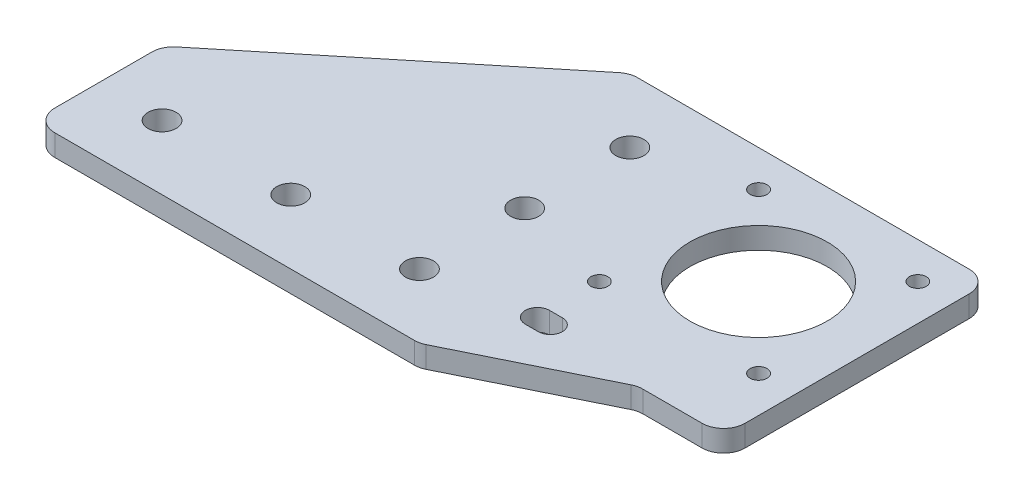
ISO-10303-21;
HEADER;
FILE_DESCRIPTION(('STEP AP214'),'2;1');
FILE_NAME('part.step','',(''),(''),'','','');
FILE_SCHEMA(('AUTOMOTIVE_DESIGN { 1 0 10303 214 1 1 1 1 }'));
ENDSEC;
DATA;
#1=APPLICATION_CONTEXT('core data for automotive mechanical design processes');
#2=APPLICATION_PROTOCOL_DEFINITION('international standard','automotive_design',2000,#1);
#3=PRODUCT_CONTEXT('',#1,'mechanical');
#4=PRODUCT('Part','Part','',(#3));
#5=PRODUCT_RELATED_PRODUCT_CATEGORY('part','',(#4));
#6=PRODUCT_DEFINITION_FORMATION('','',#4);
#7=PRODUCT_DEFINITION_CONTEXT('part definition',#1,'design');
#8=PRODUCT_DEFINITION('design','',#6,#7);
#9=PRODUCT_DEFINITION_SHAPE('','',#8);
#10=(LENGTH_UNIT() NAMED_UNIT(*) SI_UNIT(.MILLI.,.METRE.));
#11=(NAMED_UNIT(*) PLANE_ANGLE_UNIT() SI_UNIT($,.RADIAN.));
#12=(NAMED_UNIT(*) SI_UNIT($,.STERADIAN.) SOLID_ANGLE_UNIT());
#13=UNCERTAINTY_MEASURE_WITH_UNIT(LENGTH_MEASURE(1.E-05),#10,'distance_accuracy_value','');
#14=(GEOMETRIC_REPRESENTATION_CONTEXT(3) GLOBAL_UNCERTAINTY_ASSIGNED_CONTEXT((#13)) GLOBAL_UNIT_ASSIGNED_CONTEXT((#10,
#11,#12)) REPRESENTATION_CONTEXT('',''));
#15=CARTESIAN_POINT('',(0.,0.,0.));
#16=DIRECTION('',(0.,0.,1.));
#17=DIRECTION('',(1.,0.,0.));
#18=AXIS2_PLACEMENT_3D('',#15,#16,#17);
#19=CARTESIAN_POINT('',(514.35,25.3999999999964,590.55));
#20=DIRECTION('',(-0.632900218941656,0.,-0.774233371060434));
#21=DIRECTION('',(-0.774233371060434,0.,0.632900218941656));
#22=AXIS2_PLACEMENT_3D('',#19,#20,#21);
#23=PLANE('',#22);
#24=DIRECTION('',(0.774233371060434,0.,-0.632900218941656));
#25=VECTOR('',#24,1.);
#26=CARTESIAN_POINT('',(514.35,25.3999999999964,590.55));
#27=LINE('',#26,#25);
#28=CARTESIAN_POINT('',(516.68108360972,25.3999999999964,588.644446219823));
#29=VERTEX_POINT('',#28);
#30=CARTESIAN_POINT('',(588.796240187109,25.3999999999959,529.693618093766));
#31=VERTEX_POINT('',#30);
#32=EDGE_CURVE('E209',#29,#31,#27,.T.);
#33=ORIENTED_EDGE('',*,*,#32,.T.);
#34=DIRECTION('',(0.,-1.,0.));
#35=VECTOR('',#34,1.);
#36=CARTESIAN_POINT('',(588.796240187109,25.3999999999959,529.693618093766));
#37=LINE('',#36,#35);
#38=CARTESIAN_POINT('',(588.796240187109,19.0499999999959,529.693618093766));
#39=VERTEX_POINT('',#38);
#40=EDGE_CURVE('E251',#31,#39,#37,.T.);
#41=ORIENTED_EDGE('',*,*,#40,.T.);
#42=DIRECTION('',(0.774233371060434,0.,-0.632900218941656));
#43=VECTOR('',#42,1.);
#44=CARTESIAN_POINT('',(514.35,19.0499999999964,590.55));
#45=LINE('',#44,#43);
#46=CARTESIAN_POINT('',(516.68108360972,19.0499999999964,588.644446219823));
#47=VERTEX_POINT('',#46);
#48=EDGE_CURVE('E205',#47,#39,#45,.T.);
#49=ORIENTED_EDGE('',*,*,#48,.F.);
#50=DIRECTION('',(0.,-1.,0.));
#51=VECTOR('',#50,1.);
#52=CARTESIAN_POINT('',(516.68108360972,25.3999999999964,588.644446219823));
#53=LINE('',#52,#51);
#54=EDGE_CURVE('E230',#47,#29,#53,.F.);
#55=ORIENTED_EDGE('',*,*,#54,.T.);
#56=EDGE_LOOP('',(#33,#41,#49,#55));
#57=FACE_BOUND('',#56,.T.);
#58=ADVANCED_FACE('F34',(#57),#23,.T.);
#59=CARTESIAN_POINT('',(514.35,25.3999999999964,590.55));
#60=DIRECTION('',(-1.,0.,0.));
#61=DIRECTION('',(0.,-1.,0.));
#62=AXIS2_PLACEMENT_3D('',#59,#60,#61);
#63=PLANE('',#62);
#64=DIRECTION('',(0.,0.,-1.));
#65=VECTOR('',#64,1.);
#66=CARTESIAN_POINT('',(514.35,25.3999999999964,590.55));
#67=LINE('',#66,#65);
#68=CARTESIAN_POINT('',(514.35,25.3999999999964,622.300000000001));
#69=VERTEX_POINT('',#68);
#70=CARTESIAN_POINT('',(514.35,25.3999999999964,593.560828126057));
#71=VERTEX_POINT('',#70);
#72=EDGE_CURVE('E227',#69,#71,#67,.T.);
#73=ORIENTED_EDGE('',*,*,#72,.T.);
#74=DIRECTION('',(0.,-1.,0.));
#75=VECTOR('',#74,1.);
#76=CARTESIAN_POINT('',(514.35,25.3999999999964,593.560828126057));
#77=LINE('',#76,#75);
#78=CARTESIAN_POINT('',(514.35,19.0499999999964,593.560828126057));
#79=VERTEX_POINT('',#78);
#80=EDGE_CURVE('E284',#71,#79,#77,.T.);
#81=ORIENTED_EDGE('',*,*,#80,.T.);
#82=DIRECTION('',(0.,0.,-1.));
#83=VECTOR('',#82,1.);
#84=CARTESIAN_POINT('',(514.35,19.0499999999964,590.55));
#85=LINE('',#84,#83);
#86=CARTESIAN_POINT('',(514.35,19.0499999999964,622.300000000001));
#87=VERTEX_POINT('',#86);
#88=EDGE_CURVE('E213',#87,#79,#85,.T.);
#89=ORIENTED_EDGE('',*,*,#88,.F.);
#90=DIRECTION('',(0.,-1.,0.));
#91=VECTOR('',#90,1.);
#92=CARTESIAN_POINT('',(514.35,25.3999999999964,622.300000000001));
#93=LINE('',#92,#91);
#94=EDGE_CURVE('E282',#87,#69,#93,.F.);
#95=ORIENTED_EDGE('',*,*,#94,.T.);
#96=EDGE_LOOP('',(#73,#81,#89,#95));
#97=FACE_BOUND('',#96,.T.);
#98=ADVANCED_FACE('F401',(#97),#63,.T.);
#99=CARTESIAN_POINT('',(514.35,25.3999999999964,628.65));
#100=DIRECTION('',(0.,0.,1.));
#101=DIRECTION('',(1.,0.,0.));
#102=AXIS2_PLACEMENT_3D('',#99,#100,#101);
#103=PLANE('',#102);
#104=DIRECTION('',(-1.,0.,0.));
#105=VECTOR('',#104,1.);
#106=CARTESIAN_POINT('',(590.55,25.3999999999959,628.65));
#107=LINE('',#106,#105);
#108=CARTESIAN_POINT('',(627.170830477725,25.3999999999956,628.65));
#109=VERTEX_POINT('',#108);
#110=CARTESIAN_POINT('',(520.7,25.3999999999964,628.65));
#111=VERTEX_POINT('',#110);
#112=EDGE_CURVE('E224',#109,#111,#107,.T.);
#113=ORIENTED_EDGE('',*,*,#112,.T.);
#114=DIRECTION('',(0.,-1.,0.));
#115=VECTOR('',#114,1.);
#116=CARTESIAN_POINT('',(520.7,25.3999999999964,628.65));
#117=LINE('',#116,#115);
#118=CARTESIAN_POINT('',(520.7,19.0499999999964,628.65));
#119=VERTEX_POINT('',#118);
#120=EDGE_CURVE('E289',#111,#119,#117,.T.);
#121=ORIENTED_EDGE('',*,*,#120,.T.);
#122=DIRECTION('',(-1.,0.,0.));
#123=VECTOR('',#122,1.);
#124=CARTESIAN_POINT('',(514.35,19.0499999999964,628.65));
#125=LINE('',#124,#123);
#126=CARTESIAN_POINT('',(627.170830477725,19.0499999999956,628.65));
#127=VERTEX_POINT('',#126);
#128=EDGE_CURVE('E245',#127,#119,#125,.T.);
#129=ORIENTED_EDGE('',*,*,#128,.F.);
#130=DIRECTION('',(0.,-1.,0.));
#131=VECTOR('',#130,1.);
#132=CARTESIAN_POINT('',(627.170830477725,25.3999999999956,628.65));
#133=LINE('',#132,#131);
#134=EDGE_CURVE('E287',#127,#109,#133,.F.);
#135=ORIENTED_EDGE('',*,*,#134,.T.);
#136=EDGE_LOOP('',(#113,#121,#129,#135));
#137=FACE_BOUND('',#136,.T.);
#138=ADVANCED_FACE('F410',(#137),#103,.T.);
#139=CARTESIAN_POINT('',(628.65,25.3999999999956,628.65));
#140=DIRECTION('',(0.44190207955785,0.,0.897063293242148));
#141=DIRECTION('',(0.897063293242148,0.,-0.44190207955785));
#142=AXIS2_PLACEMENT_3D('',#139,#140,#141);
#143=PLANE('',#142);
#144=DIRECTION('',(-0.897063293242148,0.,0.44190207955785));
#145=VECTOR('',#144,1.);
#146=CARTESIAN_POINT('',(628.65,25.3999999999956,628.65));
#147=LINE('',#146,#145);
#148=CARTESIAN_POINT('',(670.623091317084,25.3999999999953,607.973648087913));
#149=VERTEX_POINT('',#148);
#150=CARTESIAN_POINT('',(629.976908682917,25.3999999999956,627.996351912088));
#151=VERTEX_POINT('',#150);
#152=EDGE_CURVE('E221',#149,#151,#147,.T.);
#153=ORIENTED_EDGE('',*,*,#152,.T.);
#154=DIRECTION('',(0.,-1.,0.));
#155=VECTOR('',#154,1.);
#156=CARTESIAN_POINT('',(629.976908682917,25.3999999999956,627.996351912088));
#157=LINE('',#156,#155);
#158=CARTESIAN_POINT('',(629.976908682917,19.0499999999956,627.996351912088));
#159=VERTEX_POINT('',#158);
#160=EDGE_CURVE('E294',#151,#159,#157,.T.);
#161=ORIENTED_EDGE('',*,*,#160,.T.);
#162=DIRECTION('',(-0.897063293242148,0.,0.44190207955785));
#163=VECTOR('',#162,1.);
#164=CARTESIAN_POINT('',(628.65,19.0499999999956,628.65));
#165=LINE('',#164,#163);
#166=CARTESIAN_POINT('',(670.623091317084,19.0499999999953,607.973648087913));
#167=VERTEX_POINT('',#166);
#168=EDGE_CURVE('E242',#167,#159,#165,.T.);
#169=ORIENTED_EDGE('',*,*,#168,.F.);
#170=DIRECTION('',(0.,-1.,0.));
#171=VECTOR('',#170,1.);
#172=CARTESIAN_POINT('',(670.623091317084,25.3999999999953,607.973648087913));
#173=LINE('',#172,#171);
#174=EDGE_CURVE('E292',#167,#149,#173,.F.);
#175=ORIENTED_EDGE('',*,*,#174,.T.);
#176=EDGE_LOOP('',(#153,#161,#169,#175));
#177=FACE_BOUND('',#176,.T.);
#178=ADVANCED_FACE('F419',(#177),#143,.T.);
#179=CARTESIAN_POINT('',(671.95,25.3999999999953,607.32));
#180=DIRECTION('',(0.,0.,1.));
#181=DIRECTION('',(1.,0.,0.));
#182=AXIS2_PLACEMENT_3D('',#179,#180,#181);
#183=PLANE('',#182);
#184=DIRECTION('',(-1.,0.,0.));
#185=VECTOR('',#184,1.);
#186=CARTESIAN_POINT('',(671.95,19.0499999999953,607.32));
#187=LINE('',#186,#185);
#188=CARTESIAN_POINT('',(691.,19.0499999999952,607.32));
#189=VERTEX_POINT('',#188);
#190=CARTESIAN_POINT('',(673.429169522276,19.0499999999953,607.32));
#191=VERTEX_POINT('',#190);
#192=EDGE_CURVE('E239',#189,#191,#187,.T.);
#193=ORIENTED_EDGE('',*,*,#192,.F.);
#194=DIRECTION('',(0.,-1.,0.));
#195=VECTOR('',#194,1.);
#196=CARTESIAN_POINT('',(691.,25.3999999999952,607.32));
#197=LINE('',#196,#195);
#198=CARTESIAN_POINT('',(691.,25.3999999999952,607.32));
#199=VERTEX_POINT('',#198);
#200=EDGE_CURVE('E304',#189,#199,#197,.F.);
#201=ORIENTED_EDGE('',*,*,#200,.T.);
#202=DIRECTION('',(-1.,0.,0.));
#203=VECTOR('',#202,1.);
#204=CARTESIAN_POINT('',(671.95,25.3999999999953,607.32));
#205=LINE('',#204,#203);
#206=CARTESIAN_POINT('',(673.429169522276,25.3999999999953,607.32));
#207=VERTEX_POINT('',#206);
#208=EDGE_CURVE('E218',#199,#207,#205,.T.);
#209=ORIENTED_EDGE('',*,*,#208,.T.);
#210=DIRECTION('',(0.,-1.,0.));
#211=VECTOR('',#210,1.);
#212=CARTESIAN_POINT('',(673.429169522276,19.0499999999953,607.32));
#213=LINE('',#212,#211);
#214=EDGE_CURVE('E301',#207,#191,#213,.T.);
#215=ORIENTED_EDGE('',*,*,#214,.T.);
#216=EDGE_LOOP('',(#193,#201,#209,#215));
#217=FACE_BOUND('',#216,.T.);
#218=ADVANCED_FACE('F426',(#217),#183,.T.);
#219=CARTESIAN_POINT('',(697.35,25.3999999999951,607.32));
#220=DIRECTION('',(1.,0.,0.));
#221=DIRECTION('',(0.,1.,0.));
#222=AXIS2_PLACEMENT_3D('',#219,#220,#221);
#223=PLANE('',#222);
#224=DIRECTION('',(0.,0.,1.));
#225=VECTOR('',#224,1.);
#226=CARTESIAN_POINT('',(697.35,19.0499999999951,607.32));
#227=LINE('',#226,#225);
#228=CARTESIAN_POINT('',(697.35,19.0499999999951,534.61));
#229=VERTEX_POINT('',#228);
#230=CARTESIAN_POINT('',(697.35,19.0499999999951,600.97));
#231=VERTEX_POINT('',#230);
#232=EDGE_CURVE('E236',#229,#231,#227,.T.);
#233=ORIENTED_EDGE('',*,*,#232,.F.);
#234=DIRECTION('',(0.,-1.,0.));
#235=VECTOR('',#234,1.);
#236=CARTESIAN_POINT('',(697.35,25.3999999999951,534.61));
#237=LINE('',#236,#235);
#238=CARTESIAN_POINT('',(697.35,25.3999999999951,534.61));
#239=VERTEX_POINT('',#238);
#240=EDGE_CURVE('E58',#229,#239,#237,.F.);
#241=ORIENTED_EDGE('',*,*,#240,.T.);
#242=DIRECTION('',(0.,0.,1.));
#243=VECTOR('',#242,1.);
#244=CARTESIAN_POINT('',(697.35,25.3999999999951,607.32));
#245=LINE('',#244,#243);
#246=CARTESIAN_POINT('',(697.35,25.3999999999951,600.97));
#247=VERTEX_POINT('',#246);
#248=EDGE_CURVE('E216',#239,#247,#245,.T.);
#249=ORIENTED_EDGE('',*,*,#248,.T.);
#250=DIRECTION('',(0.,-1.,0.));
#251=VECTOR('',#250,1.);
#252=CARTESIAN_POINT('',(697.35,25.3999999999951,600.97));
#253=LINE('',#252,#251);
#254=EDGE_CURVE('E297',#247,#231,#253,.T.);
#255=ORIENTED_EDGE('',*,*,#254,.T.);
#256=EDGE_LOOP('',(#233,#241,#249,#255));
#257=FACE_BOUND('',#256,.T.);
#258=ADVANCED_FACE('F431',(#257),#223,.T.);
#259=CARTESIAN_POINT('',(628.65,25.3999999999956,528.26));
#260=DIRECTION('',(0.,0.,-1.));
#261=DIRECTION('',(-1.,0.,0.));
#262=AXIS2_PLACEMENT_3D('',#259,#260,#261);
#263=PLANE('',#262);
#264=DIRECTION('',(1.,0.,0.));
#265=VECTOR('',#264,1.);
#266=CARTESIAN_POINT('',(628.65,19.0499999999956,528.26));
#267=LINE('',#266,#265);
#268=CARTESIAN_POINT('',(592.815156577388,19.0499999999959,528.26));
#269=VERTEX_POINT('',#268);
#270=CARTESIAN_POINT('',(691.,19.0499999999952,528.26));
#271=VERTEX_POINT('',#270);
#272=EDGE_CURVE('E233',#269,#271,#267,.T.);
#273=ORIENTED_EDGE('',*,*,#272,.F.);
#274=DIRECTION('',(0.,-1.,0.));
#275=VECTOR('',#274,1.);
#276=CARTESIAN_POINT('',(592.815156577388,25.3999999999959,528.26));
#277=LINE('',#276,#275);
#278=CARTESIAN_POINT('',(592.815156577388,25.3999999999959,528.26));
#279=VERTEX_POINT('',#278);
#280=EDGE_CURVE('E269',#269,#279,#277,.F.);
#281=ORIENTED_EDGE('',*,*,#280,.T.);
#282=DIRECTION('',(1.,0.,0.));
#283=VECTOR('',#282,1.);
#284=CARTESIAN_POINT('',(590.55,25.3999999999959,528.26));
#285=LINE('',#284,#283);
#286=CARTESIAN_POINT('',(691.,25.3999999999952,528.26));
#287=VERTEX_POINT('',#286);
#288=EDGE_CURVE('E212',#279,#287,#285,.T.);
#289=ORIENTED_EDGE('',*,*,#288,.T.);
#290=DIRECTION('',(0.,-1.,0.));
#291=VECTOR('',#290,1.);
#292=CARTESIAN_POINT('',(691.,25.3999999999952,528.26));
#293=LINE('',#292,#291);
#294=EDGE_CURVE('E266',#287,#271,#293,.T.);
#295=ORIENTED_EDGE('',*,*,#294,.T.);
#296=EDGE_LOOP('',(#273,#281,#289,#295));
#297=FACE_BOUND('',#296,.T.);
#298=ADVANCED_FACE('F369',(#297),#263,.T.);
#299=CARTESIAN_POINT('',(2.22044604925031E-13,25.4,0.));
#300=DIRECTION('',(0.,1.,0.));
#301=DIRECTION('',(-1.,0.,0.));
#302=AXIS2_PLACEMENT_3D('',#299,#300,#301);
#303=PLANE('',#302);
#304=CARTESIAN_POINT('',(639.43,25.3999999999964,586.18));
#305=DIRECTION('',(0.,1.,0.));
#306=DIRECTION('',(0.,0.,1.));
#307=AXIS2_PLACEMENT_3D('',#304,#305,#306);
#308=CIRCLE('',#307,2.50000000000002);
#309=CARTESIAN_POINT('',(639.43,25.3999999999964,588.68));
#310=VERTEX_POINT('',#309);
#311=EDGE_CURVE('E348',#310,#310,#308,.T.);
#312=ORIENTED_EDGE('',*,*,#311,.F.);
#313=EDGE_LOOP('',(#312));
#314=FACE_BOUND('',#313,.T.);
#315=CARTESIAN_POINT('',(686.57,25.3999999999964,586.18));
#316=DIRECTION('',(0.,1.,0.));
#317=DIRECTION('',(0.,0.,1.));
#318=AXIS2_PLACEMENT_3D('',#315,#316,#317);
#319=CIRCLE('',#318,2.49999999999992);
#320=CARTESIAN_POINT('',(686.57,25.3999999999964,588.68));
#321=VERTEX_POINT('',#320);
#322=EDGE_CURVE('E338',#321,#321,#319,.T.);
#323=ORIENTED_EDGE('',*,*,#322,.F.);
#324=EDGE_LOOP('',(#323));
#325=FACE_BOUND('',#324,.T.);
#326=CARTESIAN_POINT('',(639.43,25.3999999999964,539.04));
#327=DIRECTION('',(0.,1.,0.));
#328=DIRECTION('',(0.,0.,1.));
#329=AXIS2_PLACEMENT_3D('',#326,#327,#328);
#330=CIRCLE('',#329,2.50000000000002);
#331=CARTESIAN_POINT('',(639.43,25.3999999999964,541.54));
#332=VERTEX_POINT('',#331);
#333=EDGE_CURVE('E335',#332,#332,#330,.T.);
#334=ORIENTED_EDGE('',*,*,#333,.F.);
#335=EDGE_LOOP('',(#334));
#336=FACE_BOUND('',#335,.T.);
#337=CARTESIAN_POINT('',(686.57,25.3999999999964,539.04));
#338=DIRECTION('',(0.,1.,0.));
#339=DIRECTION('',(0.,0.,1.));
#340=AXIS2_PLACEMENT_3D('',#337,#338,#339);
#341=CIRCLE('',#340,2.49999999999992);
#342=CARTESIAN_POINT('',(686.57,25.3999999999964,541.54));
#343=VERTEX_POINT('',#342);
#344=EDGE_CURVE('E332',#343,#343,#341,.T.);
#345=ORIENTED_EDGE('',*,*,#344,.F.);
#346=EDGE_LOOP('',(#345));
#347=FACE_BOUND('',#346,.T.);
#348=CARTESIAN_POINT('',(663.,25.3999999999964,562.61));
#349=DIRECTION('',(0.,1.,0.));
#350=DIRECTION('',(0.,0.,1.));
#351=AXIS2_PLACEMENT_3D('',#348,#349,#350);
#352=CIRCLE('',#351,20.32);
#353=CARTESIAN_POINT('',(663.,25.3999999999964,582.93));
#354=VERTEX_POINT('',#353);
#355=EDGE_CURVE('E328',#354,#354,#352,.T.);
#356=ORIENTED_EDGE('',*,*,#355,.F.);
#357=EDGE_LOOP('',(#356));
#358=FACE_BOUND('',#357,.T.);
#359=CARTESIAN_POINT('',(609.6,25.3999999999964,609.6));
#360=DIRECTION('',(0.,1.,0.));
#361=DIRECTION('',(0.,0.,1.));
#362=AXIS2_PLACEMENT_3D('',#359,#360,#361);
#363=CIRCLE('',#362,4.16560000000004);
#364=CARTESIAN_POINT('',(609.6,25.3999999999964,613.7656));
#365=VERTEX_POINT('',#364);
#366=EDGE_CURVE('E324',#365,#365,#363,.T.);
#367=ORIENTED_EDGE('',*,*,#366,.F.);
#368=EDGE_LOOP('',(#367));
#369=FACE_BOUND('',#368,.T.);
#370=CARTESIAN_POINT('',(609.6,25.3999999999964,547.31));
#371=DIRECTION('',(0.,1.,0.));
#372=DIRECTION('',(0.,0.,1.));
#373=AXIS2_PLACEMENT_3D('',#370,#371,#372);
#374=CIRCLE('',#373,4.16560000000004);
#375=CARTESIAN_POINT('',(609.6,25.3999999999964,551.4756));
#376=VERTEX_POINT('',#375);
#377=EDGE_CURVE('E320',#376,#376,#374,.T.);
#378=ORIENTED_EDGE('',*,*,#377,.F.);
#379=EDGE_LOOP('',(#378));
#380=FACE_BOUND('',#379,.T.);
#381=CARTESIAN_POINT('',(609.6,25.3999999999964,578.455));
#382=DIRECTION('',(0.,1.,0.));
#383=DIRECTION('',(0.,0.,1.));
#384=AXIS2_PLACEMENT_3D('',#381,#382,#383);
#385=CIRCLE('',#384,4.16560000000004);
#386=CARTESIAN_POINT('',(609.6,25.3999999999964,582.6206));
#387=VERTEX_POINT('',#386);
#388=EDGE_CURVE('E316',#387,#387,#385,.T.);
#389=ORIENTED_EDGE('',*,*,#388,.F.);
#390=EDGE_LOOP('',(#389));
#391=FACE_BOUND('',#390,.T.);
#392=CARTESIAN_POINT('',(571.5,25.3999999999964,609.6));
#393=DIRECTION('',(0.,1.,0.));
#394=DIRECTION('',(0.,0.,1.));
#395=AXIS2_PLACEMENT_3D('',#392,#393,#394);
#396=CIRCLE('',#395,4.16560000000004);
#397=CARTESIAN_POINT('',(571.5,25.3999999999964,613.7656));
#398=VERTEX_POINT('',#397);
#399=EDGE_CURVE('E312',#398,#398,#396,.T.);
#400=ORIENTED_EDGE('',*,*,#399,.F.);
#401=EDGE_LOOP('',(#400));
#402=FACE_BOUND('',#401,.T.);
#403=CARTESIAN_POINT('',(533.4,25.3999999999964,609.6));
#404=DIRECTION('',(0.,1.,0.));
#405=DIRECTION('',(0.,0.,1.));
#406=AXIS2_PLACEMENT_3D('',#403,#404,#405);
#407=CIRCLE('',#406,4.16560000000004);
#408=CARTESIAN_POINT('',(533.4,25.3999999999964,613.7656));
#409=VERTEX_POINT('',#408);
#410=EDGE_CURVE('E192',#409,#409,#407,.T.);
#411=ORIENTED_EDGE('',*,*,#410,.F.);
#412=EDGE_LOOP('',(#411));
#413=FACE_BOUND('',#412,.T.);
#414=CARTESIAN_POINT('',(639.445,25.3999999999955,604.52));
#415=DIRECTION('',(0.,-1.,0.));
#416=DIRECTION('',(1.,0.,0.));
#417=AXIS2_PLACEMENT_3D('',#414,#415,#416);
#418=CIRCLE('',#417,3.56869999999987);
#419=CARTESIAN_POINT('',(639.445,25.3999999999955,608.0887));
#420=VERTEX_POINT('',#419);
#421=CARTESIAN_POINT('',(639.445,25.3999999999955,600.9513));
#422=VERTEX_POINT('',#421);
#423=EDGE_CURVE('E166',#420,#422,#418,.T.);
#424=ORIENTED_EDGE('',*,*,#423,.T.);
#425=DIRECTION('',(1.,0.,0.));
#426=VECTOR('',#425,1.);
#427=CARTESIAN_POINT('',(639.445,25.3999999999955,600.9513));
#428=LINE('',#427,#426);
#429=CARTESIAN_POINT('',(643.255,25.3999999999955,600.9513));
#430=VERTEX_POINT('',#429);
#431=EDGE_CURVE('E178',#422,#430,#428,.T.);
#432=ORIENTED_EDGE('',*,*,#431,.T.);
#433=CARTESIAN_POINT('',(643.255,25.3999999999955,604.52));
#434=DIRECTION('',(0.,-1.,0.));
#435=DIRECTION('',(1.,0.,0.));
#436=AXIS2_PLACEMENT_3D('',#433,#434,#435);
#437=CIRCLE('',#436,3.56869999999987);
#438=CARTESIAN_POINT('',(643.255,25.3999999999955,608.0887));
#439=VERTEX_POINT('',#438);
#440=EDGE_CURVE('E182',#430,#439,#437,.T.);
#441=ORIENTED_EDGE('',*,*,#440,.T.);
#442=DIRECTION('',(-1.,0.,0.));
#443=VECTOR('',#442,1.);
#444=CARTESIAN_POINT('',(639.445,25.3999999999955,608.0887));
#445=LINE('',#444,#443);
#446=EDGE_CURVE('E174',#439,#420,#445,.T.);
#447=ORIENTED_EDGE('',*,*,#446,.T.);
#448=EDGE_LOOP('',(#424,#432,#441,#447));
#449=FACE_BOUND('',#448,.T.);
#450=ORIENTED_EDGE('',*,*,#288,.F.);
#451=CARTESIAN_POINT('',(592.815156577388,25.3999999999959,534.61));
#452=DIRECTION('',(0.,1.,0.));
#453=DIRECTION('',(-1.,0.,0.));
#454=AXIS2_PLACEMENT_3D('',#451,#452,#453);
#455=CIRCLE('',#454,6.35);
#456=EDGE_CURVE('E280',#279,#31,#455,.T.);
#457=ORIENTED_EDGE('',*,*,#456,.T.);
#458=ORIENTED_EDGE('',*,*,#32,.F.);
#459=CARTESIAN_POINT('',(520.7,25.3999999999964,593.560828126057));
#460=DIRECTION('',(0.,1.,0.));
#461=DIRECTION('',(-1.,0.,0.));
#462=AXIS2_PLACEMENT_3D('',#459,#460,#461);
#463=CIRCLE('',#462,6.35);
#464=EDGE_CURVE('E278',#29,#71,#463,.T.);
#465=ORIENTED_EDGE('',*,*,#464,.T.);
#466=ORIENTED_EDGE('',*,*,#72,.F.);
#467=CARTESIAN_POINT('',(520.7,25.3999999999964,622.300000000001));
#468=DIRECTION('',(0.,1.,0.));
#469=DIRECTION('',(-1.,0.,0.));
#470=AXIS2_PLACEMENT_3D('',#467,#468,#469);
#471=CIRCLE('',#470,6.35);
#472=EDGE_CURVE('E276',#69,#111,#471,.T.);
#473=ORIENTED_EDGE('',*,*,#472,.T.);
#474=ORIENTED_EDGE('',*,*,#112,.F.);
#475=CARTESIAN_POINT('',(627.170830477725,25.3999999999956,622.3));
#476=DIRECTION('',(0.,1.,0.));
#477=DIRECTION('',(-1.,0.,0.));
#478=AXIS2_PLACEMENT_3D('',#475,#476,#477);
#479=CIRCLE('',#478,6.35);
#480=EDGE_CURVE('E274',#109,#151,#479,.T.);
#481=ORIENTED_EDGE('',*,*,#480,.T.);
#482=ORIENTED_EDGE('',*,*,#152,.F.);
#483=CARTESIAN_POINT('',(673.429169522276,25.3999999999953,613.67));
#484=DIRECTION('',(0.,1.,0.));
#485=DIRECTION('',(-1.,0.,0.));
#486=AXIS2_PLACEMENT_3D('',#483,#484,#485);
#487=CIRCLE('',#486,6.35);
#488=EDGE_CURVE('E11',#149,#207,#487,.F.);
#489=ORIENTED_EDGE('',*,*,#488,.T.);
#490=ORIENTED_EDGE('',*,*,#208,.F.);
#491=CARTESIAN_POINT('',(691.,25.3999999999952,600.97));
#492=DIRECTION('',(0.,1.,0.));
#493=DIRECTION('',(-1.,0.,0.));
#494=AXIS2_PLACEMENT_3D('',#491,#492,#493);
#495=CIRCLE('',#494,6.35);
#496=EDGE_CURVE('E51',#199,#247,#495,.T.);
#497=ORIENTED_EDGE('',*,*,#496,.T.);
#498=ORIENTED_EDGE('',*,*,#248,.F.);
#499=CARTESIAN_POINT('',(691.,25.3999999999952,534.61));
#500=DIRECTION('',(0.,1.,0.));
#501=DIRECTION('',(-1.,0.,0.));
#502=AXIS2_PLACEMENT_3D('',#499,#500,#501);
#503=CIRCLE('',#502,6.35);
#504=EDGE_CURVE('E272',#239,#287,#503,.T.);
#505=ORIENTED_EDGE('',*,*,#504,.T.);
#506=EDGE_LOOP('',(#450,#457,#458,#465,#466,#473,#474,#481,#482,#489,#490,#497,#498,#505));
#507=FACE_BOUND('',#506,.T.);
#508=ADVANCED_FACE('F184',(#314,#325,#336,#347,#358,#369,#380,#391,#402,#413,#449,#507),#303,.T.);
#509=CARTESIAN_POINT('',(1.11022302462516E-13,19.05,0.));
#510=DIRECTION('',(0.,1.,0.));
#511=DIRECTION('',(-1.,0.,0.));
#512=AXIS2_PLACEMENT_3D('',#509,#510,#511);
#513=PLANE('',#512);
#514=CARTESIAN_POINT('',(639.43,19.0499999999955,586.18));
#515=DIRECTION('',(0.,1.,0.));
#516=DIRECTION('',(-1.,0.,0.));
#517=AXIS2_PLACEMENT_3D('',#514,#515,#516);
#518=CIRCLE('',#517,2.50000000000002);
#519=CARTESIAN_POINT('',(636.93,19.0499999999956,586.18));
#520=VERTEX_POINT('',#519);
#521=EDGE_CURVE('E38',#520,#520,#518,.F.);
#522=ORIENTED_EDGE('',*,*,#521,.F.);
#523=EDGE_LOOP('',(#522));
#524=FACE_BOUND('',#523,.T.);
#525=CARTESIAN_POINT('',(686.57,19.0499999999952,586.18));
#526=DIRECTION('',(0.,1.,0.));
#527=DIRECTION('',(-1.,0.,0.));
#528=AXIS2_PLACEMENT_3D('',#525,#526,#527);
#529=CIRCLE('',#528,2.49999999999992);
#530=CARTESIAN_POINT('',(684.07,19.0499999999952,586.18));
#531=VERTEX_POINT('',#530);
#532=EDGE_CURVE('E336',#531,#531,#529,.F.);
#533=ORIENTED_EDGE('',*,*,#532,.F.);
#534=EDGE_LOOP('',(#533));
#535=FACE_BOUND('',#534,.T.);
#536=CARTESIAN_POINT('',(639.43,19.0499999999955,539.04));
#537=DIRECTION('',(0.,1.,0.));
#538=DIRECTION('',(-1.,0.,0.));
#539=AXIS2_PLACEMENT_3D('',#536,#537,#538);
#540=CIRCLE('',#539,2.50000000000002);
#541=CARTESIAN_POINT('',(636.93,19.0499999999956,539.04));
#542=VERTEX_POINT('',#541);
#543=EDGE_CURVE('E333',#542,#542,#540,.F.);
#544=ORIENTED_EDGE('',*,*,#543,.F.);
#545=EDGE_LOOP('',(#544));
#546=FACE_BOUND('',#545,.T.);
#547=CARTESIAN_POINT('',(686.57,19.0499999999952,539.04));
#548=DIRECTION('',(0.,1.,0.));
#549=DIRECTION('',(-1.,0.,0.));
#550=AXIS2_PLACEMENT_3D('',#547,#548,#549);
#551=CIRCLE('',#550,2.49999999999992);
#552=CARTESIAN_POINT('',(684.07,19.0499999999952,539.04));
#553=VERTEX_POINT('',#552);
#554=EDGE_CURVE('E329',#553,#553,#551,.F.);
#555=ORIENTED_EDGE('',*,*,#554,.F.);
#556=EDGE_LOOP('',(#555));
#557=FACE_BOUND('',#556,.T.);
#558=CARTESIAN_POINT('',(663.,19.0499999999954,562.61));
#559=DIRECTION('',(0.,1.,0.));
#560=DIRECTION('',(-1.,0.,0.));
#561=AXIS2_PLACEMENT_3D('',#558,#559,#560);
#562=CIRCLE('',#561,20.32);
#563=CARTESIAN_POINT('',(642.68,19.0499999999955,562.61));
#564=VERTEX_POINT('',#563);
#565=EDGE_CURVE('E325',#564,#564,#562,.F.);
#566=ORIENTED_EDGE('',*,*,#565,.F.);
#567=EDGE_LOOP('',(#566));
#568=FACE_BOUND('',#567,.T.);
#569=CARTESIAN_POINT('',(609.6,19.0499999999957,609.6));
#570=DIRECTION('',(0.,1.,0.));
#571=DIRECTION('',(-1.,0.,0.));
#572=AXIS2_PLACEMENT_3D('',#569,#570,#571);
#573=CIRCLE('',#572,4.16560000000004);
#574=CARTESIAN_POINT('',(605.4344,19.0499999999958,609.6));
#575=VERTEX_POINT('',#574);
#576=EDGE_CURVE('E321',#575,#575,#573,.F.);
#577=ORIENTED_EDGE('',*,*,#576,.F.);
#578=EDGE_LOOP('',(#577));
#579=FACE_BOUND('',#578,.T.);
#580=CARTESIAN_POINT('',(609.6,19.0499999999957,547.31));
#581=DIRECTION('',(0.,1.,0.));
#582=DIRECTION('',(-1.,0.,0.));
#583=AXIS2_PLACEMENT_3D('',#580,#581,#582);
#584=CIRCLE('',#583,4.16560000000004);
#585=CARTESIAN_POINT('',(605.4344,19.0499999999958,547.31));
#586=VERTEX_POINT('',#585);
#587=EDGE_CURVE('E317',#586,#586,#584,.F.);
#588=ORIENTED_EDGE('',*,*,#587,.F.);
#589=EDGE_LOOP('',(#588));
#590=FACE_BOUND('',#589,.T.);
#591=CARTESIAN_POINT('',(609.6,19.0499999999957,578.455));
#592=DIRECTION('',(0.,1.,0.));
#593=DIRECTION('',(-1.,0.,0.));
#594=AXIS2_PLACEMENT_3D('',#591,#592,#593);
#595=CIRCLE('',#594,4.16560000000004);
#596=CARTESIAN_POINT('',(605.4344,19.0499999999958,578.455));
#597=VERTEX_POINT('',#596);
#598=EDGE_CURVE('E313',#597,#597,#595,.F.);
#599=ORIENTED_EDGE('',*,*,#598,.F.);
#600=EDGE_LOOP('',(#599));
#601=FACE_BOUND('',#600,.T.);
#602=CARTESIAN_POINT('',(571.5,19.049999999996,609.6));
#603=DIRECTION('',(0.,1.,0.));
#604=DIRECTION('',(-1.,0.,0.));
#605=AXIS2_PLACEMENT_3D('',#602,#603,#604);
#606=CIRCLE('',#605,4.16560000000004);
#607=CARTESIAN_POINT('',(567.3344,19.049999999996,609.6));
#608=VERTEX_POINT('',#607);
#609=EDGE_CURVE('E309',#608,#608,#606,.F.);
#610=ORIENTED_EDGE('',*,*,#609,.F.);
#611=EDGE_LOOP('',(#610));
#612=FACE_BOUND('',#611,.T.);
#613=CARTESIAN_POINT('',(533.4,19.0499999999963,609.6));
#614=DIRECTION('',(0.,1.,0.));
#615=DIRECTION('',(-1.,0.,0.));
#616=AXIS2_PLACEMENT_3D('',#613,#614,#615);
#617=CIRCLE('',#616,4.16560000000004);
#618=CARTESIAN_POINT('',(529.2344,19.0499999999963,609.6));
#619=VERTEX_POINT('',#618);
#620=EDGE_CURVE('E199',#619,#619,#617,.F.);
#621=ORIENTED_EDGE('',*,*,#620,.F.);
#622=EDGE_LOOP('',(#621));
#623=FACE_BOUND('',#622,.T.);
#624=DIRECTION('',(1.,0.,0.));
#625=VECTOR('',#624,1.);
#626=CARTESIAN_POINT('',(639.445,19.0499999999955,600.9513));
#627=LINE('',#626,#625);
#628=CARTESIAN_POINT('',(639.445,19.0499999999955,600.9513));
#629=VERTEX_POINT('',#628);
#630=CARTESIAN_POINT('',(643.255,19.0499999999955,600.9513));
#631=VERTEX_POINT('',#630);
#632=EDGE_CURVE('E198',#629,#631,#627,.T.);
#633=ORIENTED_EDGE('',*,*,#632,.F.);
#634=CARTESIAN_POINT('',(639.445,19.0499999999955,604.52));
#635=DIRECTION('',(0.,-1.,0.));
#636=DIRECTION('',(1.,0.,0.));
#637=AXIS2_PLACEMENT_3D('',#634,#635,#636);
#638=CIRCLE('',#637,3.56869999999987);
#639=CARTESIAN_POINT('',(639.445,19.0499999999955,608.0887));
#640=VERTEX_POINT('',#639);
#641=EDGE_CURVE('E169',#640,#629,#638,.T.);
#642=ORIENTED_EDGE('',*,*,#641,.F.);
#643=DIRECTION('',(-1.,0.,0.));
#644=VECTOR('',#643,1.);
#645=CARTESIAN_POINT('',(639.445,19.0499999999955,608.0887));
#646=LINE('',#645,#644);
#647=CARTESIAN_POINT('',(643.255,19.0499999999955,608.0887));
#648=VERTEX_POINT('',#647);
#649=EDGE_CURVE('E186',#648,#640,#646,.T.);
#650=ORIENTED_EDGE('',*,*,#649,.F.);
#651=CARTESIAN_POINT('',(643.255,19.0499999999955,604.52));
#652=DIRECTION('',(0.,-1.,0.));
#653=DIRECTION('',(1.,0.,0.));
#654=AXIS2_PLACEMENT_3D('',#651,#652,#653);
#655=CIRCLE('',#654,3.56869999999987);
#656=EDGE_CURVE('E189',#631,#648,#655,.T.);
#657=ORIENTED_EDGE('',*,*,#656,.F.);
#658=EDGE_LOOP('',(#633,#642,#650,#657));
#659=FACE_BOUND('',#658,.T.);
#660=ORIENTED_EDGE('',*,*,#48,.T.);
#661=CARTESIAN_POINT('',(592.815156577388,19.0499999999959,534.61));
#662=DIRECTION('',(0.,1.,0.));
#663=DIRECTION('',(-1.,0.,0.));
#664=AXIS2_PLACEMENT_3D('',#661,#662,#663);
#665=CIRCLE('',#664,6.35);
#666=EDGE_CURVE('E264',#39,#269,#665,.F.);
#667=ORIENTED_EDGE('',*,*,#666,.T.);
#668=ORIENTED_EDGE('',*,*,#272,.T.);
#669=CARTESIAN_POINT('',(691.,19.0499999999952,534.61));
#670=DIRECTION('',(0.,1.,0.));
#671=DIRECTION('',(-1.,0.,0.));
#672=AXIS2_PLACEMENT_3D('',#669,#670,#671);
#673=CIRCLE('',#672,6.35);
#674=EDGE_CURVE('E256',#271,#229,#673,.F.);
#675=ORIENTED_EDGE('',*,*,#674,.T.);
#676=ORIENTED_EDGE('',*,*,#232,.T.);
#677=CARTESIAN_POINT('',(691.,19.0499999999952,600.97));
#678=DIRECTION('',(0.,1.,0.));
#679=DIRECTION('',(-1.,0.,0.));
#680=AXIS2_PLACEMENT_3D('',#677,#678,#679);
#681=CIRCLE('',#680,6.35);
#682=EDGE_CURVE('E254',#231,#189,#681,.F.);
#683=ORIENTED_EDGE('',*,*,#682,.T.);
#684=ORIENTED_EDGE('',*,*,#192,.T.);
#685=CARTESIAN_POINT('',(673.429169522276,19.0499999999953,613.67));
#686=DIRECTION('',(0.,1.,0.));
#687=DIRECTION('',(-1.,0.,0.));
#688=AXIS2_PLACEMENT_3D('',#685,#686,#687);
#689=CIRCLE('',#688,6.35);
#690=EDGE_CURVE('E43',#191,#167,#689,.T.);
#691=ORIENTED_EDGE('',*,*,#690,.T.);
#692=ORIENTED_EDGE('',*,*,#168,.T.);
#693=CARTESIAN_POINT('',(627.170830477725,19.0499999999956,622.3));
#694=DIRECTION('',(0.,1.,0.));
#695=DIRECTION('',(-1.,0.,0.));
#696=AXIS2_PLACEMENT_3D('',#693,#694,#695);
#697=CIRCLE('',#696,6.35);
#698=EDGE_CURVE('E258',#159,#127,#697,.F.);
#699=ORIENTED_EDGE('',*,*,#698,.T.);
#700=ORIENTED_EDGE('',*,*,#128,.T.);
#701=CARTESIAN_POINT('',(520.7,19.0499999999964,622.300000000001));
#702=DIRECTION('',(0.,1.,0.));
#703=DIRECTION('',(-1.,0.,0.));
#704=AXIS2_PLACEMENT_3D('',#701,#702,#703);
#705=CIRCLE('',#704,6.35);
#706=EDGE_CURVE('E260',#119,#87,#705,.F.);
#707=ORIENTED_EDGE('',*,*,#706,.T.);
#708=ORIENTED_EDGE('',*,*,#88,.T.);
#709=CARTESIAN_POINT('',(520.7,19.0499999999964,593.560828126057));
#710=DIRECTION('',(0.,1.,0.));
#711=DIRECTION('',(-1.,0.,0.));
#712=AXIS2_PLACEMENT_3D('',#709,#710,#711);
#713=CIRCLE('',#712,6.35);
#714=EDGE_CURVE('E262',#79,#47,#713,.F.);
#715=ORIENTED_EDGE('',*,*,#714,.T.);
#716=EDGE_LOOP('',(#660,#667,#668,#675,#676,#683,#684,#691,#692,#699,#700,#707,#708,#715));
#717=FACE_BOUND('',#716,.T.);
#718=ADVANCED_FACE('F368',(#524,#535,#546,#557,#568,#579,#590,#601,#612,#623,#659,#717),#513,.F.);
#719=CARTESIAN_POINT('',(639.445,25.3999999999955,604.52));
#720=DIRECTION('',(0.,-1.,0.));
#721=DIRECTION('',(1.,0.,0.));
#722=AXIS2_PLACEMENT_3D('',#719,#720,#721);
#723=CYLINDRICAL_SURFACE('',#722,3.56869999999987);
#724=ORIENTED_EDGE('',*,*,#641,.T.);
#725=DIRECTION('',(0.,-1.,0.));
#726=VECTOR('',#725,1.);
#727=CARTESIAN_POINT('',(639.445,25.3999999999955,600.9513));
#728=LINE('',#727,#726);
#729=EDGE_CURVE('E162',#422,#629,#728,.T.);
#730=ORIENTED_EDGE('',*,*,#729,.F.);
#731=ORIENTED_EDGE('',*,*,#423,.F.);
#732=DIRECTION('',(0.,-1.,0.));
#733=VECTOR('',#732,1.);
#734=CARTESIAN_POINT('',(639.445,25.3999999999955,608.0887));
#735=LINE('',#734,#733);
#736=EDGE_CURVE('E203',#420,#640,#735,.T.);
#737=ORIENTED_EDGE('',*,*,#736,.T.);
#738=EDGE_LOOP('',(#724,#730,#731,#737));
#739=FACE_BOUND('',#738,.T.);
#740=ADVANCED_FACE('F164',(#739),#723,.F.);
#741=CARTESIAN_POINT('',(639.445,25.3999999999955,608.0887));
#742=DIRECTION('',(0.,0.,1.));
#743=DIRECTION('',(1.,0.,0.));
#744=AXIS2_PLACEMENT_3D('',#741,#742,#743);
#745=PLANE('',#744);
#746=ORIENTED_EDGE('',*,*,#649,.T.);
#747=ORIENTED_EDGE('',*,*,#736,.F.);
#748=ORIENTED_EDGE('',*,*,#446,.F.);
#749=DIRECTION('',(0.,-1.,0.));
#750=VECTOR('',#749,1.);
#751=CARTESIAN_POINT('',(643.255,25.3999999999955,608.0887));
#752=LINE('',#751,#750);
#753=EDGE_CURVE('E206',#439,#648,#752,.T.);
#754=ORIENTED_EDGE('',*,*,#753,.T.);
#755=EDGE_LOOP('',(#746,#747,#748,#754));
#756=FACE_BOUND('',#755,.T.);
#757=ADVANCED_FACE('F468',(#756),#745,.F.);
#758=CARTESIAN_POINT('',(643.255,25.3999999999955,604.52));
#759=DIRECTION('',(0.,-1.,0.));
#760=DIRECTION('',(1.,0.,0.));
#761=AXIS2_PLACEMENT_3D('',#758,#759,#760);
#762=CYLINDRICAL_SURFACE('',#761,3.56869999999987);
#763=ORIENTED_EDGE('',*,*,#656,.T.);
#764=ORIENTED_EDGE('',*,*,#753,.F.);
#765=ORIENTED_EDGE('',*,*,#440,.F.);
#766=DIRECTION('',(0.,-1.,0.));
#767=VECTOR('',#766,1.);
#768=CARTESIAN_POINT('',(643.255,25.3999999999955,600.9513));
#769=LINE('',#768,#767);
#770=EDGE_CURVE('E173',#430,#631,#769,.T.);
#771=ORIENTED_EDGE('',*,*,#770,.T.);
#772=EDGE_LOOP('',(#763,#764,#765,#771));
#773=FACE_BOUND('',#772,.T.);
#774=ADVANCED_FACE('F448',(#773),#762,.F.);
#775=CARTESIAN_POINT('',(639.445,25.3999999999955,600.9513));
#776=DIRECTION('',(0.,0.,-1.));
#777=DIRECTION('',(-1.,0.,0.));
#778=AXIS2_PLACEMENT_3D('',#775,#776,#777);
#779=PLANE('',#778);
#780=ORIENTED_EDGE('',*,*,#632,.T.);
#781=ORIENTED_EDGE('',*,*,#770,.F.);
#782=ORIENTED_EDGE('',*,*,#431,.F.);
#783=ORIENTED_EDGE('',*,*,#729,.T.);
#784=EDGE_LOOP('',(#780,#781,#782,#783));
#785=FACE_BOUND('',#784,.T.);
#786=ADVANCED_FACE('F179',(#785),#779,.F.);
#787=CARTESIAN_POINT('',(592.815156577388,25.3999999999959,534.61));
#788=DIRECTION('',(0.,-1.,0.));
#789=DIRECTION('',(1.,0.,0.));
#790=AXIS2_PLACEMENT_3D('',#787,#788,#789);
#791=CYLINDRICAL_SURFACE('',#790,6.35);
#792=ORIENTED_EDGE('',*,*,#456,.F.);
#793=ORIENTED_EDGE('',*,*,#280,.F.);
#794=ORIENTED_EDGE('',*,*,#666,.F.);
#795=ORIENTED_EDGE('',*,*,#40,.F.);
#796=EDGE_LOOP('',(#792,#793,#794,#795));
#797=FACE_BOUND('',#796,.T.);
#798=ADVANCED_FACE('F440',(#797),#791,.T.);
#799=CARTESIAN_POINT('',(520.7,25.3999999999964,593.560828126057));
#800=DIRECTION('',(0.,-1.,0.));
#801=DIRECTION('',(1.,0.,0.));
#802=AXIS2_PLACEMENT_3D('',#799,#800,#801);
#803=CYLINDRICAL_SURFACE('',#802,6.35);
#804=ORIENTED_EDGE('',*,*,#464,.F.);
#805=ORIENTED_EDGE('',*,*,#54,.F.);
#806=ORIENTED_EDGE('',*,*,#714,.F.);
#807=ORIENTED_EDGE('',*,*,#80,.F.);
#808=EDGE_LOOP('',(#804,#805,#806,#807));
#809=FACE_BOUND('',#808,.T.);
#810=ADVANCED_FACE('F395',(#809),#803,.T.);
#811=CARTESIAN_POINT('',(520.7,25.3999999999964,622.300000000001));
#812=DIRECTION('',(0.,-1.,0.));
#813=DIRECTION('',(1.,0.,0.));
#814=AXIS2_PLACEMENT_3D('',#811,#812,#813);
#815=CYLINDRICAL_SURFACE('',#814,6.35);
#816=ORIENTED_EDGE('',*,*,#472,.F.);
#817=ORIENTED_EDGE('',*,*,#94,.F.);
#818=ORIENTED_EDGE('',*,*,#706,.F.);
#819=ORIENTED_EDGE('',*,*,#120,.F.);
#820=EDGE_LOOP('',(#816,#817,#818,#819));
#821=FACE_BOUND('',#820,.T.);
#822=ADVANCED_FACE('F405',(#821),#815,.T.);
#823=CARTESIAN_POINT('',(627.170830477725,25.3999999999956,622.3));
#824=DIRECTION('',(0.,-1.,0.));
#825=DIRECTION('',(1.,0.,0.));
#826=AXIS2_PLACEMENT_3D('',#823,#824,#825);
#827=CYLINDRICAL_SURFACE('',#826,6.35);
#828=ORIENTED_EDGE('',*,*,#480,.F.);
#829=ORIENTED_EDGE('',*,*,#134,.F.);
#830=ORIENTED_EDGE('',*,*,#698,.F.);
#831=ORIENTED_EDGE('',*,*,#160,.F.);
#832=EDGE_LOOP('',(#828,#829,#830,#831));
#833=FACE_BOUND('',#832,.T.);
#834=ADVANCED_FACE('F414',(#833),#827,.T.);
#835=CARTESIAN_POINT('',(691.,25.3999999999952,534.61));
#836=DIRECTION('',(0.,-1.,0.));
#837=DIRECTION('',(1.,0.,0.));
#838=AXIS2_PLACEMENT_3D('',#835,#836,#837);
#839=CYLINDRICAL_SURFACE('',#838,6.35);
#840=ORIENTED_EDGE('',*,*,#504,.F.);
#841=ORIENTED_EDGE('',*,*,#240,.F.);
#842=ORIENTED_EDGE('',*,*,#674,.F.);
#843=ORIENTED_EDGE('',*,*,#294,.F.);
#844=EDGE_LOOP('',(#840,#841,#842,#843));
#845=FACE_BOUND('',#844,.T.);
#846=ADVANCED_FACE('F435',(#845),#839,.T.);
#847=CARTESIAN_POINT('',(691.,25.3999999999952,600.97));
#848=DIRECTION('',(0.,-1.,0.));
#849=DIRECTION('',(1.,0.,0.));
#850=AXIS2_PLACEMENT_3D('',#847,#848,#849);
#851=CYLINDRICAL_SURFACE('',#850,6.35);
#852=ORIENTED_EDGE('',*,*,#496,.F.);
#853=ORIENTED_EDGE('',*,*,#200,.F.);
#854=ORIENTED_EDGE('',*,*,#682,.F.);
#855=ORIENTED_EDGE('',*,*,#254,.F.);
#856=EDGE_LOOP('',(#852,#853,#854,#855));
#857=FACE_BOUND('',#856,.T.);
#858=ADVANCED_FACE('F429',(#857),#851,.T.);
#859=CARTESIAN_POINT('',(673.429169522276,25.3999999999953,613.67));
#860=DIRECTION('',(0.,1.,0.));
#861=DIRECTION('',(-1.,0.,0.));
#862=AXIS2_PLACEMENT_3D('',#859,#860,#861);
#863=CYLINDRICAL_SURFACE('',#862,6.35);
#864=ORIENTED_EDGE('',*,*,#488,.F.);
#865=ORIENTED_EDGE('',*,*,#174,.F.);
#866=ORIENTED_EDGE('',*,*,#690,.F.);
#867=ORIENTED_EDGE('',*,*,#214,.F.);
#868=EDGE_LOOP('',(#864,#865,#866,#867));
#869=FACE_BOUND('',#868,.T.);
#870=ADVANCED_FACE('F36',(#869),#863,.F.);
#871=CARTESIAN_POINT('',(533.4,25.3999999999964,609.6));
#872=DIRECTION('',(0.,-1.,0.));
#873=DIRECTION('',(0.,0.,-1.));
#874=AXIS2_PLACEMENT_3D('',#871,#872,#873);
#875=CYLINDRICAL_SURFACE('',#874,4.16560000000004);
#876=ORIENTED_EDGE('',*,*,#410,.T.);
#877=EDGE_LOOP('',(#876));
#878=FACE_BOUND('',#877,.T.);
#879=ORIENTED_EDGE('',*,*,#620,.T.);
#880=EDGE_LOOP('',(#879));
#881=FACE_BOUND('',#880,.T.);
#882=ADVANCED_FACE('F375',(#878,#881),#875,.F.);
#883=CARTESIAN_POINT('',(571.5,25.3999999999964,609.6));
#884=DIRECTION('',(0.,-1.,0.));
#885=DIRECTION('',(0.,0.,-1.));
#886=AXIS2_PLACEMENT_3D('',#883,#884,#885);
#887=CYLINDRICAL_SURFACE('',#886,4.16560000000004);
#888=ORIENTED_EDGE('',*,*,#399,.T.);
#889=EDGE_LOOP('',(#888));
#890=FACE_BOUND('',#889,.T.);
#891=ORIENTED_EDGE('',*,*,#609,.T.);
#892=EDGE_LOOP('',(#891));
#893=FACE_BOUND('',#892,.T.);
#894=ADVANCED_FACE('F363',(#890,#893),#887,.F.);
#895=CARTESIAN_POINT('',(609.6,25.3999999999964,578.455));
#896=DIRECTION('',(0.,-1.,0.));
#897=DIRECTION('',(0.,0.,-1.));
#898=AXIS2_PLACEMENT_3D('',#895,#896,#897);
#899=CYLINDRICAL_SURFACE('',#898,4.16560000000004);
#900=ORIENTED_EDGE('',*,*,#388,.T.);
#901=EDGE_LOOP('',(#900));
#902=FACE_BOUND('',#901,.T.);
#903=ORIENTED_EDGE('',*,*,#598,.T.);
#904=EDGE_LOOP('',(#903));
#905=FACE_BOUND('',#904,.T.);
#906=ADVANCED_FACE('F478',(#902,#905),#899,.F.);
#907=CARTESIAN_POINT('',(609.6,25.3999999999964,547.31));
#908=DIRECTION('',(0.,-1.,0.));
#909=DIRECTION('',(0.,0.,-1.));
#910=AXIS2_PLACEMENT_3D('',#907,#908,#909);
#911=CYLINDRICAL_SURFACE('',#910,4.16560000000004);
#912=ORIENTED_EDGE('',*,*,#377,.T.);
#913=EDGE_LOOP('',(#912));
#914=FACE_BOUND('',#913,.T.);
#915=ORIENTED_EDGE('',*,*,#587,.T.);
#916=EDGE_LOOP('',(#915));
#917=FACE_BOUND('',#916,.T.);
#918=ADVANCED_FACE('F481',(#914,#917),#911,.F.);
#919=CARTESIAN_POINT('',(609.6,25.3999999999964,609.6));
#920=DIRECTION('',(0.,-1.,0.));
#921=DIRECTION('',(0.,0.,-1.));
#922=AXIS2_PLACEMENT_3D('',#919,#920,#921);
#923=CYLINDRICAL_SURFACE('',#922,4.16560000000004);
#924=ORIENTED_EDGE('',*,*,#366,.T.);
#925=EDGE_LOOP('',(#924));
#926=FACE_BOUND('',#925,.T.);
#927=ORIENTED_EDGE('',*,*,#576,.T.);
#928=EDGE_LOOP('',(#927));
#929=FACE_BOUND('',#928,.T.);
#930=ADVANCED_FACE('F485',(#926,#929),#923,.F.);
#931=CARTESIAN_POINT('',(663.,25.3999999999964,562.61));
#932=DIRECTION('',(0.,-1.,0.));
#933=DIRECTION('',(0.,0.,-1.));
#934=AXIS2_PLACEMENT_3D('',#931,#932,#933);
#935=CYLINDRICAL_SURFACE('',#934,20.32);
#936=ORIENTED_EDGE('',*,*,#355,.T.);
#937=EDGE_LOOP('',(#936));
#938=FACE_BOUND('',#937,.T.);
#939=ORIENTED_EDGE('',*,*,#565,.T.);
#940=EDGE_LOOP('',(#939));
#941=FACE_BOUND('',#940,.T.);
#942=ADVANCED_FACE('F489',(#938,#941),#935,.F.);
#943=CARTESIAN_POINT('',(686.57,25.3999999999964,539.04));
#944=DIRECTION('',(0.,-1.,0.));
#945=DIRECTION('',(0.,0.,-1.));
#946=AXIS2_PLACEMENT_3D('',#943,#944,#945);
#947=CYLINDRICAL_SURFACE('',#946,2.49999999999992);
#948=ORIENTED_EDGE('',*,*,#344,.T.);
#949=EDGE_LOOP('',(#948));
#950=FACE_BOUND('',#949,.T.);
#951=ORIENTED_EDGE('',*,*,#554,.T.);
#952=EDGE_LOOP('',(#951));
#953=FACE_BOUND('',#952,.T.);
#954=ADVANCED_FACE('F493',(#950,#953),#947,.F.);
#955=CARTESIAN_POINT('',(639.43,25.3999999999964,539.04));
#956=DIRECTION('',(0.,-1.,0.));
#957=DIRECTION('',(0.,0.,-1.));
#958=AXIS2_PLACEMENT_3D('',#955,#956,#957);
#959=CYLINDRICAL_SURFACE('',#958,2.50000000000002);
#960=ORIENTED_EDGE('',*,*,#333,.T.);
#961=EDGE_LOOP('',(#960));
#962=FACE_BOUND('',#961,.T.);
#963=ORIENTED_EDGE('',*,*,#543,.T.);
#964=EDGE_LOOP('',(#963));
#965=FACE_BOUND('',#964,.T.);
#966=ADVANCED_FACE('F497',(#962,#965),#959,.F.);
#967=CARTESIAN_POINT('',(686.57,25.3999999999964,586.18));
#968=DIRECTION('',(0.,-1.,0.));
#969=DIRECTION('',(0.,0.,-1.));
#970=AXIS2_PLACEMENT_3D('',#967,#968,#969);
#971=CYLINDRICAL_SURFACE('',#970,2.49999999999992);
#972=ORIENTED_EDGE('',*,*,#322,.T.);
#973=EDGE_LOOP('',(#972));
#974=FACE_BOUND('',#973,.T.);
#975=ORIENTED_EDGE('',*,*,#532,.T.);
#976=EDGE_LOOP('',(#975));
#977=FACE_BOUND('',#976,.T.);
#978=ADVANCED_FACE('F501',(#974,#977),#971,.F.);
#979=CARTESIAN_POINT('',(639.43,25.3999999999964,586.18));
#980=DIRECTION('',(0.,-1.,0.));
#981=DIRECTION('',(0.,0.,-1.));
#982=AXIS2_PLACEMENT_3D('',#979,#980,#981);
#983=CYLINDRICAL_SURFACE('',#982,2.50000000000002);
#984=ORIENTED_EDGE('',*,*,#311,.T.);
#985=EDGE_LOOP('',(#984));
#986=FACE_BOUND('',#985,.T.);
#987=ORIENTED_EDGE('',*,*,#521,.T.);
#988=EDGE_LOOP('',(#987));
#989=FACE_BOUND('',#988,.T.);
#990=ADVANCED_FACE('F505',(#986,#989),#983,.F.);
#991=CLOSED_SHELL('',(#58,#98,#138,#178,#218,#258,#298,#508,#718,#740,#757,#774,#786,#798,#810,
#822,#834,#846,#858,#870,#882,#894,#906,#918,#930,#942,#954,#966,#978,#990));
#992=MANIFOLD_SOLID_BREP('B2',#991);
#993=ADVANCED_BREP_SHAPE_REPRESENTATION('',(#18,#992),#14);
#994=SHAPE_DEFINITION_REPRESENTATION(#9,#993);
ENDSEC;
END-ISO-10303-21;
